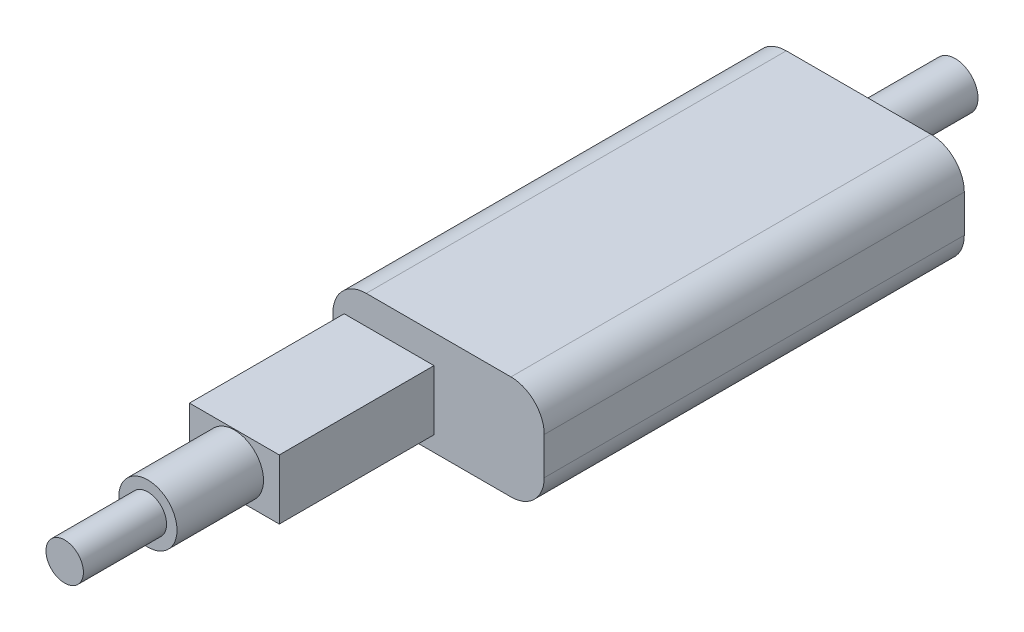
ISO-10303-21;
HEADER;
FILE_DESCRIPTION(('STEP AP214'),'2;1');
FILE_NAME('part.step','',(''),(''),'','','');
FILE_SCHEMA(('AUTOMOTIVE_DESIGN { 1 0 10303 214 1 1 1 1 }'));
ENDSEC;
DATA;
#1=APPLICATION_CONTEXT('core data for automotive mechanical design processes');
#2=APPLICATION_PROTOCOL_DEFINITION('international standard','automotive_design',2000,#1);
#3=PRODUCT_CONTEXT('',#1,'mechanical');
#4=PRODUCT('Part','Part','',(#3));
#5=PRODUCT_RELATED_PRODUCT_CATEGORY('part','',(#4));
#6=PRODUCT_DEFINITION_FORMATION('','',#4);
#7=PRODUCT_DEFINITION_CONTEXT('part definition',#1,'design');
#8=PRODUCT_DEFINITION('design','',#6,#7);
#9=PRODUCT_DEFINITION_SHAPE('','',#8);
#10=(LENGTH_UNIT() NAMED_UNIT(*) SI_UNIT(.MILLI.,.METRE.));
#11=(NAMED_UNIT(*) PLANE_ANGLE_UNIT() SI_UNIT($,.RADIAN.));
#12=(NAMED_UNIT(*) SI_UNIT($,.STERADIAN.) SOLID_ANGLE_UNIT());
#13=UNCERTAINTY_MEASURE_WITH_UNIT(LENGTH_MEASURE(1.E-05),#10,'distance_accuracy_value','');
#14=(GEOMETRIC_REPRESENTATION_CONTEXT(3) GLOBAL_UNCERTAINTY_ASSIGNED_CONTEXT((#13)) GLOBAL_UNIT_ASSIGNED_CONTEXT((#10,
#11,#12)) REPRESENTATION_CONTEXT('',''));
#15=CARTESIAN_POINT('',(0.,0.,0.));
#16=DIRECTION('',(0.,0.,1.));
#17=DIRECTION('',(1.,0.,0.));
#18=AXIS2_PLACEMENT_3D('',#15,#16,#17);
#19=CARTESIAN_POINT('',(0.,0.,-25.25));
#20=DIRECTION('',(0.,0.,1.));
#21=DIRECTION('',(1.,0.,0.));
#22=AXIS2_PLACEMENT_3D('',#19,#20,#21);
#23=PLANE('',#22);
#24=DIRECTION('',(1.,0.,0.));
#25=VECTOR('',#24,1.);
#26=CARTESIAN_POINT('',(-12.7,-6.25,-25.25));
#27=LINE('',#26,#25);
#28=CARTESIAN_POINT('',(-8.7,-6.25,-25.25));
#29=VERTEX_POINT('',#28);
#30=CARTESIAN_POINT('',(8.7,-6.25,-25.25));
#31=VERTEX_POINT('',#30);
#32=EDGE_CURVE('E315',#29,#31,#27,.T.);
#33=ORIENTED_EDGE('',*,*,#32,.F.);
#34=CARTESIAN_POINT('',(-8.7,-2.25,-25.25));
#35=DIRECTION('',(0.,0.,1.));
#36=DIRECTION('',(1.,0.,0.));
#37=AXIS2_PLACEMENT_3D('',#34,#35,#36);
#38=CIRCLE('',#37,4.);
#39=CARTESIAN_POINT('',(-12.7,-2.25,-25.25));
#40=VERTEX_POINT('',#39);
#41=EDGE_CURVE('E333',#29,#40,#38,.F.);
#42=ORIENTED_EDGE('',*,*,#41,.T.);
#43=DIRECTION('',(0.,-1.,0.));
#44=VECTOR('',#43,1.);
#45=CARTESIAN_POINT('',(-12.7,6.25,-25.25));
#46=LINE('',#45,#44);
#47=CARTESIAN_POINT('',(-12.7,2.25,-25.25));
#48=VERTEX_POINT('',#47);
#49=EDGE_CURVE('E298',#48,#40,#46,.T.);
#50=ORIENTED_EDGE('',*,*,#49,.F.);
#51=CARTESIAN_POINT('',(-8.7,2.25,-25.25));
#52=DIRECTION('',(0.,0.,1.));
#53=DIRECTION('',(1.,0.,0.));
#54=AXIS2_PLACEMENT_3D('',#51,#52,#53);
#55=CIRCLE('',#54,4.);
#56=CARTESIAN_POINT('',(-8.7,6.25,-25.25));
#57=VERTEX_POINT('',#56);
#58=EDGE_CURVE('E327',#48,#57,#55,.F.);
#59=ORIENTED_EDGE('',*,*,#58,.T.);
#60=DIRECTION('',(-1.,0.,0.));
#61=VECTOR('',#60,1.);
#62=CARTESIAN_POINT('',(-12.7,6.25,-25.25));
#63=LINE('',#62,#61);
#64=CARTESIAN_POINT('',(8.7,6.25,-25.25));
#65=VERTEX_POINT('',#64);
#66=EDGE_CURVE('E303',#65,#57,#63,.T.);
#67=ORIENTED_EDGE('',*,*,#66,.F.);
#68=CARTESIAN_POINT('',(8.7,2.25,-25.25));
#69=DIRECTION('',(0.,0.,1.));
#70=DIRECTION('',(1.,0.,0.));
#71=AXIS2_PLACEMENT_3D('',#68,#69,#70);
#72=CIRCLE('',#71,4.);
#73=CARTESIAN_POINT('',(12.7,2.25,-25.25));
#74=VERTEX_POINT('',#73);
#75=EDGE_CURVE('E329',#65,#74,#72,.F.);
#76=ORIENTED_EDGE('',*,*,#75,.T.);
#77=DIRECTION('',(0.,1.,0.));
#78=VECTOR('',#77,1.);
#79=CARTESIAN_POINT('',(12.7,6.25,-25.25));
#80=LINE('',#79,#78);
#81=CARTESIAN_POINT('',(12.7,-2.25,-25.25));
#82=VERTEX_POINT('',#81);
#83=EDGE_CURVE('E318',#82,#74,#80,.T.);
#84=ORIENTED_EDGE('',*,*,#83,.F.);
#85=CARTESIAN_POINT('',(8.7,-2.25,-25.25));
#86=DIRECTION('',(0.,0.,1.));
#87=DIRECTION('',(1.,0.,0.));
#88=AXIS2_PLACEMENT_3D('',#85,#86,#87);
#89=CIRCLE('',#88,4.);
#90=EDGE_CURVE('E331',#82,#31,#89,.F.);
#91=ORIENTED_EDGE('',*,*,#90,.T.);
#92=EDGE_LOOP('',(#33,#42,#50,#59,#67,#76,#84,#91));
#93=FACE_BOUND('',#92,.T.);
#94=DIRECTION('',(0.,-1.,0.));
#95=VECTOR('',#94,1.);
#96=CARTESIAN_POINT('',(7.5,3.75,-25.25));
#97=LINE('',#96,#95);
#98=CARTESIAN_POINT('',(7.5,3.75,-25.25));
#99=VERTEX_POINT('',#98);
#100=CARTESIAN_POINT('',(7.5,-1.85,-25.25));
#101=VERTEX_POINT('',#100);
#102=EDGE_CURVE('E57',#99,#101,#97,.T.);
#103=ORIENTED_EDGE('',*,*,#102,.F.);
#104=DIRECTION('',(1.,0.,0.));
#105=VECTOR('',#104,1.);
#106=CARTESIAN_POINT('',(7.5,3.75,-25.25));
#107=LINE('',#106,#105);
#108=CARTESIAN_POINT('',(-7.5,3.75,-25.25));
#109=VERTEX_POINT('',#108);
#110=EDGE_CURVE('E204',#109,#99,#107,.T.);
#111=ORIENTED_EDGE('',*,*,#110,.F.);
#112=DIRECTION('',(0.,1.,0.));
#113=VECTOR('',#112,1.);
#114=CARTESIAN_POINT('',(-7.5,3.75,-25.25));
#115=LINE('',#114,#113);
#116=CARTESIAN_POINT('',(-7.5,-1.85,-25.25));
#117=VERTEX_POINT('',#116);
#118=EDGE_CURVE('E211',#117,#109,#115,.T.);
#119=ORIENTED_EDGE('',*,*,#118,.F.);
#120=DIRECTION('',(-1.,0.,0.));
#121=VECTOR('',#120,1.);
#122=CARTESIAN_POINT('',(7.5,-1.85,-25.25));
#123=LINE('',#122,#121);
#124=EDGE_CURVE('E208',#101,#117,#123,.T.);
#125=ORIENTED_EDGE('',*,*,#124,.F.);
#126=EDGE_LOOP('',(#103,#111,#119,#125));
#127=FACE_BOUND('',#126,.T.);
#128=ADVANCED_FACE('F33',(#93,#127),#23,.F.);
#129=CARTESIAN_POINT('',(0.,0.,25.25));
#130=DIRECTION('',(0.,0.,1.));
#131=DIRECTION('',(1.,0.,0.));
#132=AXIS2_PLACEMENT_3D('',#129,#130,#131);
#133=PLANE('',#132);
#134=DIRECTION('',(0.,-1.,0.));
#135=VECTOR('',#134,1.);
#136=CARTESIAN_POINT('',(-12.7,6.25,25.25));
#137=LINE('',#136,#135);
#138=CARTESIAN_POINT('',(-12.7,2.25,25.25));
#139=VERTEX_POINT('',#138);
#140=CARTESIAN_POINT('',(-12.7,-2.25,25.25));
#141=VERTEX_POINT('',#140);
#142=EDGE_CURVE('E299',#139,#141,#137,.T.);
#143=ORIENTED_EDGE('',*,*,#142,.T.);
#144=CARTESIAN_POINT('',(-8.7,-2.25,25.25));
#145=DIRECTION('',(0.,0.,1.));
#146=DIRECTION('',(1.,0.,0.));
#147=AXIS2_PLACEMENT_3D('',#144,#145,#146);
#148=CIRCLE('',#147,4.);
#149=CARTESIAN_POINT('',(-8.7,-6.25,25.25));
#150=VERTEX_POINT('',#149);
#151=EDGE_CURVE('E346',#141,#150,#148,.T.);
#152=ORIENTED_EDGE('',*,*,#151,.T.);
#153=DIRECTION('',(1.,0.,0.));
#154=VECTOR('',#153,1.);
#155=CARTESIAN_POINT('',(-12.7,-6.25,25.25));
#156=LINE('',#155,#154);
#157=CARTESIAN_POINT('',(8.7,-6.25,25.25));
#158=VERTEX_POINT('',#157);
#159=EDGE_CURVE('E302',#150,#158,#156,.T.);
#160=ORIENTED_EDGE('',*,*,#159,.T.);
#161=CARTESIAN_POINT('',(8.7,-2.25,25.25));
#162=DIRECTION('',(0.,0.,1.));
#163=DIRECTION('',(1.,0.,0.));
#164=AXIS2_PLACEMENT_3D('',#161,#162,#163);
#165=CIRCLE('',#164,4.);
#166=CARTESIAN_POINT('',(12.7,-2.25,25.25));
#167=VERTEX_POINT('',#166);
#168=EDGE_CURVE('E344',#158,#167,#165,.T.);
#169=ORIENTED_EDGE('',*,*,#168,.T.);
#170=DIRECTION('',(0.,1.,0.));
#171=VECTOR('',#170,1.);
#172=CARTESIAN_POINT('',(12.7,6.25,25.25));
#173=LINE('',#172,#171);
#174=CARTESIAN_POINT('',(12.7,2.25,25.25));
#175=VERTEX_POINT('',#174);
#176=EDGE_CURVE('E306',#167,#175,#173,.T.);
#177=ORIENTED_EDGE('',*,*,#176,.T.);
#178=CARTESIAN_POINT('',(8.7,2.25,25.25));
#179=DIRECTION('',(0.,0.,1.));
#180=DIRECTION('',(1.,0.,0.));
#181=AXIS2_PLACEMENT_3D('',#178,#179,#180);
#182=CIRCLE('',#181,4.);
#183=CARTESIAN_POINT('',(8.7,6.25,25.25));
#184=VERTEX_POINT('',#183);
#185=EDGE_CURVE('E342',#175,#184,#182,.T.);
#186=ORIENTED_EDGE('',*,*,#185,.T.);
#187=DIRECTION('',(-1.,0.,0.));
#188=VECTOR('',#187,1.);
#189=CARTESIAN_POINT('',(-12.7,6.25,25.25));
#190=LINE('',#189,#188);
#191=CARTESIAN_POINT('',(-8.7,6.25,25.25));
#192=VERTEX_POINT('',#191);
#193=EDGE_CURVE('E309',#184,#192,#190,.T.);
#194=ORIENTED_EDGE('',*,*,#193,.T.);
#195=CARTESIAN_POINT('',(-8.7,2.25,25.25));
#196=DIRECTION('',(0.,0.,1.));
#197=DIRECTION('',(1.,0.,0.));
#198=AXIS2_PLACEMENT_3D('',#195,#196,#197);
#199=CIRCLE('',#198,4.);
#200=EDGE_CURVE('E340',#192,#139,#199,.T.);
#201=ORIENTED_EDGE('',*,*,#200,.T.);
#202=EDGE_LOOP('',(#143,#152,#160,#169,#177,#186,#194,#201));
#203=FACE_BOUND('',#202,.T.);
#204=DIRECTION('',(1.,0.,0.));
#205=VECTOR('',#204,1.);
#206=CARTESIAN_POINT('',(-7.9,-0.250000000000002,25.25));
#207=LINE('',#206,#205);
#208=CARTESIAN_POINT('',(-7.9,-0.250000000000002,25.25));
#209=VERTEX_POINT('',#208);
#210=CARTESIAN_POINT('',(-1.,-0.250000000000002,25.25));
#211=VERTEX_POINT('',#210);
#212=EDGE_CURVE('E283',#209,#211,#207,.T.);
#213=ORIENTED_EDGE('',*,*,#212,.F.);
#214=DIRECTION('',(0.,-1.,0.));
#215=VECTOR('',#214,1.);
#216=CARTESIAN_POINT('',(-7.9,1.65,25.25));
#217=LINE('',#216,#215);
#218=CARTESIAN_POINT('',(-7.9,1.65,25.25));
#219=VERTEX_POINT('',#218);
#220=EDGE_CURVE('E266',#219,#209,#217,.T.);
#221=ORIENTED_EDGE('',*,*,#220,.F.);
#222=DIRECTION('',(-1.,0.,0.));
#223=VECTOR('',#222,1.);
#224=CARTESIAN_POINT('',(-7.9,1.65,25.25));
#225=LINE('',#224,#223);
#226=CARTESIAN_POINT('',(-1.,1.65,25.25));
#227=VERTEX_POINT('',#226);
#228=EDGE_CURVE('E271',#227,#219,#225,.T.);
#229=ORIENTED_EDGE('',*,*,#228,.F.);
#230=DIRECTION('',(0.,1.,0.));
#231=VECTOR('',#230,1.);
#232=CARTESIAN_POINT('',(-1.,1.65,25.25));
#233=LINE('',#232,#231);
#234=EDGE_CURVE('E285',#211,#227,#233,.T.);
#235=ORIENTED_EDGE('',*,*,#234,.F.);
#236=EDGE_LOOP('',(#213,#221,#229,#235));
#237=FACE_BOUND('',#236,.T.);
#238=ADVANCED_FACE('F375',(#203,#237),#133,.T.);
#239=CARTESIAN_POINT('',(-12.7,6.25,25.25));
#240=DIRECTION('',(1.,0.,0.));
#241=DIRECTION('',(0.,0.,-1.));
#242=AXIS2_PLACEMENT_3D('',#239,#240,#241);
#243=PLANE('',#242);
#244=ORIENTED_EDGE('',*,*,#49,.T.);
#245=DIRECTION('',(0.,0.,-1.));
#246=VECTOR('',#245,1.);
#247=CARTESIAN_POINT('',(-12.7,-2.25,25.25));
#248=LINE('',#247,#246);
#249=EDGE_CURVE('E338',#40,#141,#248,.F.);
#250=ORIENTED_EDGE('',*,*,#249,.T.);
#251=ORIENTED_EDGE('',*,*,#142,.F.);
#252=DIRECTION('',(0.,0.,-1.));
#253=VECTOR('',#252,1.);
#254=CARTESIAN_POINT('',(-12.7,2.25,25.25));
#255=LINE('',#254,#253);
#256=EDGE_CURVE('E335',#139,#48,#255,.T.);
#257=ORIENTED_EDGE('',*,*,#256,.T.);
#258=EDGE_LOOP('',(#244,#250,#251,#257));
#259=FACE_BOUND('',#258,.T.);
#260=ADVANCED_FACE('F371',(#259),#243,.F.);
#261=CARTESIAN_POINT('',(-12.7,-6.25,25.25));
#262=DIRECTION('',(0.,1.,0.));
#263=DIRECTION('',(-1.,0.,0.));
#264=AXIS2_PLACEMENT_3D('',#261,#262,#263);
#265=PLANE('',#264);
#266=ORIENTED_EDGE('',*,*,#159,.F.);
#267=DIRECTION('',(0.,0.,-1.));
#268=VECTOR('',#267,1.);
#269=CARTESIAN_POINT('',(-8.7,-6.25,25.25));
#270=LINE('',#269,#268);
#271=EDGE_CURVE('E324',#150,#29,#270,.T.);
#272=ORIENTED_EDGE('',*,*,#271,.T.);
#273=ORIENTED_EDGE('',*,*,#32,.T.);
#274=DIRECTION('',(0.,0.,-1.));
#275=VECTOR('',#274,1.);
#276=CARTESIAN_POINT('',(8.7,-6.25,25.25));
#277=LINE('',#276,#275);
#278=EDGE_CURVE('E312',#31,#158,#277,.F.);
#279=ORIENTED_EDGE('',*,*,#278,.T.);
#280=EDGE_LOOP('',(#266,#272,#273,#279));
#281=FACE_BOUND('',#280,.T.);
#282=ADVANCED_FACE('F382',(#281),#265,.F.);
#283=CARTESIAN_POINT('',(12.7,6.25,25.25));
#284=DIRECTION('',(-1.,0.,0.));
#285=DIRECTION('',(0.,0.,1.));
#286=AXIS2_PLACEMENT_3D('',#283,#284,#285);
#287=PLANE('',#286);
#288=ORIENTED_EDGE('',*,*,#176,.F.);
#289=DIRECTION('',(0.,0.,-1.));
#290=VECTOR('',#289,1.);
#291=CARTESIAN_POINT('',(12.7,-2.25,25.25));
#292=LINE('',#291,#290);
#293=EDGE_CURVE('E350',#167,#82,#292,.T.);
#294=ORIENTED_EDGE('',*,*,#293,.T.);
#295=ORIENTED_EDGE('',*,*,#83,.T.);
#296=DIRECTION('',(0.,0.,-1.));
#297=VECTOR('',#296,1.);
#298=CARTESIAN_POINT('',(12.7,2.25,25.25));
#299=LINE('',#298,#297);
#300=EDGE_CURVE('E348',#74,#175,#299,.F.);
#301=ORIENTED_EDGE('',*,*,#300,.T.);
#302=EDGE_LOOP('',(#288,#294,#295,#301));
#303=FACE_BOUND('',#302,.T.);
#304=ADVANCED_FACE('F390',(#303),#287,.F.);
#305=CARTESIAN_POINT('',(-12.7,6.25,25.25));
#306=DIRECTION('',(0.,-1.,0.));
#307=DIRECTION('',(0.,0.,-1.));
#308=AXIS2_PLACEMENT_3D('',#305,#306,#307);
#309=PLANE('',#308);
#310=ORIENTED_EDGE('',*,*,#193,.F.);
#311=DIRECTION('',(0.,0.,-1.));
#312=VECTOR('',#311,1.);
#313=CARTESIAN_POINT('',(8.7,6.25,25.25));
#314=LINE('',#313,#312);
#315=EDGE_CURVE('E37',#184,#65,#314,.T.);
#316=ORIENTED_EDGE('',*,*,#315,.T.);
#317=ORIENTED_EDGE('',*,*,#66,.T.);
#318=DIRECTION('',(0.,0.,-1.));
#319=VECTOR('',#318,1.);
#320=CARTESIAN_POINT('',(-8.7,6.25,25.25));
#321=LINE('',#320,#319);
#322=EDGE_CURVE('E352',#57,#192,#321,.F.);
#323=ORIENTED_EDGE('',*,*,#322,.T.);
#324=EDGE_LOOP('',(#310,#316,#317,#323));
#325=FACE_BOUND('',#324,.T.);
#326=ADVANCED_FACE('F359',(#325),#309,.F.);
#327=CARTESIAN_POINT('',(-8.7,-2.25,25.25));
#328=DIRECTION('',(0.,0.,-1.));
#329=DIRECTION('',(-1.,0.,0.));
#330=AXIS2_PLACEMENT_3D('',#327,#328,#329);
#331=CYLINDRICAL_SURFACE('',#330,4.);
#332=ORIENTED_EDGE('',*,*,#151,.F.);
#333=ORIENTED_EDGE('',*,*,#249,.F.);
#334=ORIENTED_EDGE('',*,*,#41,.F.);
#335=ORIENTED_EDGE('',*,*,#271,.F.);
#336=EDGE_LOOP('',(#332,#333,#334,#335));
#337=FACE_BOUND('',#336,.T.);
#338=ADVANCED_FACE('F380',(#337),#331,.T.);
#339=CARTESIAN_POINT('',(8.7,-2.25,25.25));
#340=DIRECTION('',(0.,0.,-1.));
#341=DIRECTION('',(-1.,0.,0.));
#342=AXIS2_PLACEMENT_3D('',#339,#340,#341);
#343=CYLINDRICAL_SURFACE('',#342,4.);
#344=ORIENTED_EDGE('',*,*,#168,.F.);
#345=ORIENTED_EDGE('',*,*,#278,.F.);
#346=ORIENTED_EDGE('',*,*,#90,.F.);
#347=ORIENTED_EDGE('',*,*,#293,.F.);
#348=EDGE_LOOP('',(#344,#345,#346,#347));
#349=FACE_BOUND('',#348,.T.);
#350=ADVANCED_FACE('F387',(#349),#343,.T.);
#351=CARTESIAN_POINT('',(8.7,2.25,25.25));
#352=DIRECTION('',(0.,0.,-1.));
#353=DIRECTION('',(-1.,0.,0.));
#354=AXIS2_PLACEMENT_3D('',#351,#352,#353);
#355=CYLINDRICAL_SURFACE('',#354,4.);
#356=ORIENTED_EDGE('',*,*,#185,.F.);
#357=ORIENTED_EDGE('',*,*,#300,.F.);
#358=ORIENTED_EDGE('',*,*,#75,.F.);
#359=ORIENTED_EDGE('',*,*,#315,.F.);
#360=EDGE_LOOP('',(#356,#357,#358,#359));
#361=FACE_BOUND('',#360,.T.);
#362=ADVANCED_FACE('F392',(#361),#355,.T.);
#363=CARTESIAN_POINT('',(-8.7,2.25,25.25));
#364=DIRECTION('',(0.,0.,-1.));
#365=DIRECTION('',(-1.,0.,0.));
#366=AXIS2_PLACEMENT_3D('',#363,#364,#365);
#367=CYLINDRICAL_SURFACE('',#366,4.);
#368=ORIENTED_EDGE('',*,*,#200,.F.);
#369=ORIENTED_EDGE('',*,*,#322,.F.);
#370=ORIENTED_EDGE('',*,*,#58,.F.);
#371=ORIENTED_EDGE('',*,*,#256,.F.);
#372=EDGE_LOOP('',(#368,#369,#370,#371));
#373=FACE_BOUND('',#372,.T.);
#374=ADVANCED_FACE('F35',(#373),#367,.T.);
#375=CARTESIAN_POINT('',(-7.9,1.65,26.75));
#376=DIRECTION('',(1.,0.,0.));
#377=DIRECTION('',(0.,0.,-1.));
#378=AXIS2_PLACEMENT_3D('',#375,#376,#377);
#379=PLANE('',#378);
#380=ORIENTED_EDGE('',*,*,#220,.T.);
#381=DIRECTION('',(0.,0.,-1.));
#382=VECTOR('',#381,1.);
#383=CARTESIAN_POINT('',(-7.9,-0.250000000000002,26.75));
#384=LINE('',#383,#382);
#385=CARTESIAN_POINT('',(-7.9,-0.250000000000002,26.75));
#386=VERTEX_POINT('',#385);
#387=EDGE_CURVE('E296',#386,#209,#384,.T.);
#388=ORIENTED_EDGE('',*,*,#387,.F.);
#389=DIRECTION('',(0.,-1.,0.));
#390=VECTOR('',#389,1.);
#391=CARTESIAN_POINT('',(-7.9,1.65,26.75));
#392=LINE('',#391,#390);
#393=CARTESIAN_POINT('',(-7.9,1.65,26.75));
#394=VERTEX_POINT('',#393);
#395=EDGE_CURVE('E267',#394,#386,#392,.T.);
#396=ORIENTED_EDGE('',*,*,#395,.F.);
#397=DIRECTION('',(0.,0.,-1.));
#398=VECTOR('',#397,1.);
#399=CARTESIAN_POINT('',(-7.9,1.65,26.75));
#400=LINE('',#399,#398);
#401=EDGE_CURVE('E280',#394,#219,#400,.T.);
#402=ORIENTED_EDGE('',*,*,#401,.T.);
#403=EDGE_LOOP('',(#380,#388,#396,#402));
#404=FACE_BOUND('',#403,.T.);
#405=ADVANCED_FACE('F398',(#404),#379,.F.);
#406=CARTESIAN_POINT('',(-7.9,-0.250000000000002,26.75));
#407=DIRECTION('',(0.,1.,0.));
#408=DIRECTION('',(0.,0.,1.));
#409=AXIS2_PLACEMENT_3D('',#406,#407,#408);
#410=PLANE('',#409);
#411=ORIENTED_EDGE('',*,*,#212,.T.);
#412=DIRECTION('',(0.,0.,-1.));
#413=VECTOR('',#412,1.);
#414=CARTESIAN_POINT('',(-1.,-0.250000000000002,26.75));
#415=LINE('',#414,#413);
#416=CARTESIAN_POINT('',(-1.,-0.250000000000002,26.75));
#417=VERTEX_POINT('',#416);
#418=EDGE_CURVE('E293',#417,#211,#415,.T.);
#419=ORIENTED_EDGE('',*,*,#418,.F.);
#420=DIRECTION('',(1.,0.,0.));
#421=VECTOR('',#420,1.);
#422=CARTESIAN_POINT('',(-7.9,-0.250000000000002,26.75));
#423=LINE('',#422,#421);
#424=EDGE_CURVE('E270',#386,#417,#423,.T.);
#425=ORIENTED_EDGE('',*,*,#424,.F.);
#426=ORIENTED_EDGE('',*,*,#387,.T.);
#427=EDGE_LOOP('',(#411,#419,#425,#426));
#428=FACE_BOUND('',#427,.T.);
#429=ADVANCED_FACE('F452',(#428),#410,.F.);
#430=CARTESIAN_POINT('',(-1.,1.65,26.75));
#431=DIRECTION('',(-1.,0.,0.));
#432=DIRECTION('',(0.,-1.,0.));
#433=AXIS2_PLACEMENT_3D('',#430,#431,#432);
#434=PLANE('',#433);
#435=ORIENTED_EDGE('',*,*,#234,.T.);
#436=DIRECTION('',(0.,0.,-1.));
#437=VECTOR('',#436,1.);
#438=CARTESIAN_POINT('',(-1.,1.65,26.75));
#439=LINE('',#438,#437);
#440=CARTESIAN_POINT('',(-1.,1.65,26.75));
#441=VERTEX_POINT('',#440);
#442=EDGE_CURVE('E291',#441,#227,#439,.T.);
#443=ORIENTED_EDGE('',*,*,#442,.F.);
#444=DIRECTION('',(0.,1.,0.));
#445=VECTOR('',#444,1.);
#446=CARTESIAN_POINT('',(-1.,1.65,26.75));
#447=LINE('',#446,#445);
#448=EDGE_CURVE('E274',#417,#441,#447,.T.);
#449=ORIENTED_EDGE('',*,*,#448,.F.);
#450=ORIENTED_EDGE('',*,*,#418,.T.);
#451=EDGE_LOOP('',(#435,#443,#449,#450));
#452=FACE_BOUND('',#451,.T.);
#453=ADVANCED_FACE('F461',(#452),#434,.F.);
#454=CARTESIAN_POINT('',(-7.9,1.65,26.75));
#455=DIRECTION('',(0.,-1.,0.));
#456=DIRECTION('',(1.,0.,0.));
#457=AXIS2_PLACEMENT_3D('',#454,#455,#456);
#458=PLANE('',#457);
#459=ORIENTED_EDGE('',*,*,#228,.T.);
#460=ORIENTED_EDGE('',*,*,#401,.F.);
#461=DIRECTION('',(-1.,0.,0.));
#462=VECTOR('',#461,1.);
#463=CARTESIAN_POINT('',(-7.9,1.65,26.75));
#464=LINE('',#463,#462);
#465=EDGE_CURVE('E277',#441,#394,#464,.T.);
#466=ORIENTED_EDGE('',*,*,#465,.F.);
#467=ORIENTED_EDGE('',*,*,#442,.T.);
#468=EDGE_LOOP('',(#459,#460,#466,#467));
#469=FACE_BOUND('',#468,.T.);
#470=ADVANCED_FACE('F471',(#469),#458,.F.);
#471=CARTESIAN_POINT('',(0.,0.,26.75));
#472=DIRECTION('',(0.,0.,1.));
#473=DIRECTION('',(1.,0.,0.));
#474=AXIS2_PLACEMENT_3D('',#471,#472,#473);
#475=PLANE('',#474);
#476=DIRECTION('',(0.,-1.,0.));
#477=VECTOR('',#476,1.);
#478=CARTESIAN_POINT('',(-9.85,4.3,26.75));
#479=LINE('',#478,#477);
#480=CARTESIAN_POINT('',(-9.85,4.3,26.75));
#481=VERTEX_POINT('',#480);
#482=CARTESIAN_POINT('',(-9.85,-2.9,26.75));
#483=VERTEX_POINT('',#482);
#484=EDGE_CURVE('E234',#481,#483,#479,.T.);
#485=ORIENTED_EDGE('',*,*,#484,.F.);
#486=DIRECTION('',(-1.,0.,0.));
#487=VECTOR('',#486,1.);
#488=CARTESIAN_POINT('',(-9.85,4.3,26.75));
#489=LINE('',#488,#487);
#490=CARTESIAN_POINT('',(0.949999999999999,4.3,26.75));
#491=VERTEX_POINT('',#490);
#492=EDGE_CURVE('E241',#491,#481,#489,.T.);
#493=ORIENTED_EDGE('',*,*,#492,.F.);
#494=DIRECTION('',(0.,1.,0.));
#495=VECTOR('',#494,1.);
#496=CARTESIAN_POINT('',(0.949999999999999,4.3,26.75));
#497=LINE('',#496,#495);
#498=CARTESIAN_POINT('',(0.949999999999999,-2.9,26.75));
#499=VERTEX_POINT('',#498);
#500=EDGE_CURVE('E252',#499,#491,#497,.T.);
#501=ORIENTED_EDGE('',*,*,#500,.F.);
#502=DIRECTION('',(1.,0.,0.));
#503=VECTOR('',#502,1.);
#504=CARTESIAN_POINT('',(-9.85,-2.9,26.75));
#505=LINE('',#504,#503);
#506=EDGE_CURVE('E250',#483,#499,#505,.T.);
#507=ORIENTED_EDGE('',*,*,#506,.F.);
#508=EDGE_LOOP('',(#485,#493,#501,#507));
#509=FACE_BOUND('',#508,.T.);
#510=ORIENTED_EDGE('',*,*,#465,.T.);
#511=ORIENTED_EDGE('',*,*,#395,.T.);
#512=ORIENTED_EDGE('',*,*,#424,.T.);
#513=ORIENTED_EDGE('',*,*,#448,.T.);
#514=EDGE_LOOP('',(#510,#511,#512,#513));
#515=FACE_BOUND('',#514,.T.);
#516=ADVANCED_FACE('F481',(#509,#515),#475,.F.);
#517=CARTESIAN_POINT('',(-9.85,4.3,45.35));
#518=DIRECTION('',(1.,0.,0.));
#519=DIRECTION('',(0.,0.,-1.));
#520=AXIS2_PLACEMENT_3D('',#517,#518,#519);
#521=PLANE('',#520);
#522=ORIENTED_EDGE('',*,*,#484,.T.);
#523=DIRECTION('',(0.,0.,-1.));
#524=VECTOR('',#523,1.);
#525=CARTESIAN_POINT('',(-9.85,-2.9,45.35));
#526=LINE('',#525,#524);
#527=CARTESIAN_POINT('',(-9.85,-2.9,45.35));
#528=VERTEX_POINT('',#527);
#529=EDGE_CURVE('E263',#528,#483,#526,.T.);
#530=ORIENTED_EDGE('',*,*,#529,.F.);
#531=DIRECTION('',(0.,-1.,0.));
#532=VECTOR('',#531,1.);
#533=CARTESIAN_POINT('',(-9.85,4.3,45.35));
#534=LINE('',#533,#532);
#535=CARTESIAN_POINT('',(-9.85,4.3,45.35));
#536=VERTEX_POINT('',#535);
#537=EDGE_CURVE('E237',#536,#528,#534,.T.);
#538=ORIENTED_EDGE('',*,*,#537,.F.);
#539=DIRECTION('',(0.,0.,-1.));
#540=VECTOR('',#539,1.);
#541=CARTESIAN_POINT('',(-9.85,4.3,45.35));
#542=LINE('',#541,#540);
#543=EDGE_CURVE('E247',#536,#481,#542,.T.);
#544=ORIENTED_EDGE('',*,*,#543,.T.);
#545=EDGE_LOOP('',(#522,#530,#538,#544));
#546=FACE_BOUND('',#545,.T.);
#547=ADVANCED_FACE('F491',(#546),#521,.F.);
#548=CARTESIAN_POINT('',(-9.85,-2.9,45.35));
#549=DIRECTION('',(0.,1.,0.));
#550=DIRECTION('',(-1.,0.,0.));
#551=AXIS2_PLACEMENT_3D('',#548,#549,#550);
#552=PLANE('',#551);
#553=ORIENTED_EDGE('',*,*,#506,.T.);
#554=DIRECTION('',(0.,0.,-1.));
#555=VECTOR('',#554,1.);
#556=CARTESIAN_POINT('',(0.949999999999999,-2.9,45.35));
#557=LINE('',#556,#555);
#558=CARTESIAN_POINT('',(0.949999999999999,-2.9,45.35));
#559=VERTEX_POINT('',#558);
#560=EDGE_CURVE('E260',#559,#499,#557,.T.);
#561=ORIENTED_EDGE('',*,*,#560,.F.);
#562=DIRECTION('',(1.,0.,0.));
#563=VECTOR('',#562,1.);
#564=CARTESIAN_POINT('',(-9.85,-2.9,45.35));
#565=LINE('',#564,#563);
#566=EDGE_CURVE('E240',#528,#559,#565,.T.);
#567=ORIENTED_EDGE('',*,*,#566,.F.);
#568=ORIENTED_EDGE('',*,*,#529,.T.);
#569=EDGE_LOOP('',(#553,#561,#567,#568));
#570=FACE_BOUND('',#569,.T.);
#571=ADVANCED_FACE('F501',(#570),#552,.F.);
#572=CARTESIAN_POINT('',(0.949999999999999,4.3,45.35));
#573=DIRECTION('',(-1.,0.,0.));
#574=DIRECTION('',(0.,0.,1.));
#575=AXIS2_PLACEMENT_3D('',#572,#573,#574);
#576=PLANE('',#575);
#577=ORIENTED_EDGE('',*,*,#500,.T.);
#578=DIRECTION('',(0.,0.,-1.));
#579=VECTOR('',#578,1.);
#580=CARTESIAN_POINT('',(0.949999999999999,4.3,45.35));
#581=LINE('',#580,#579);
#582=CARTESIAN_POINT('',(0.949999999999999,4.3,45.35));
#583=VERTEX_POINT('',#582);
#584=EDGE_CURVE('E257',#583,#491,#581,.T.);
#585=ORIENTED_EDGE('',*,*,#584,.F.);
#586=DIRECTION('',(0.,1.,0.));
#587=VECTOR('',#586,1.);
#588=CARTESIAN_POINT('',(0.949999999999999,4.3,45.35));
#589=LINE('',#588,#587);
#590=EDGE_CURVE('E243',#559,#583,#589,.T.);
#591=ORIENTED_EDGE('',*,*,#590,.F.);
#592=ORIENTED_EDGE('',*,*,#560,.T.);
#593=EDGE_LOOP('',(#577,#585,#591,#592));
#594=FACE_BOUND('',#593,.T.);
#595=ADVANCED_FACE('F511',(#594),#576,.F.);
#596=CARTESIAN_POINT('',(-9.85,4.3,45.35));
#597=DIRECTION('',(0.,-1.,0.));
#598=DIRECTION('',(1.,0.,0.));
#599=AXIS2_PLACEMENT_3D('',#596,#597,#598);
#600=PLANE('',#599);
#601=ORIENTED_EDGE('',*,*,#492,.T.);
#602=ORIENTED_EDGE('',*,*,#543,.F.);
#603=DIRECTION('',(-1.,0.,0.));
#604=VECTOR('',#603,1.);
#605=CARTESIAN_POINT('',(-9.85,4.3,45.35));
#606=LINE('',#605,#604);
#607=EDGE_CURVE('E245',#583,#536,#606,.T.);
#608=ORIENTED_EDGE('',*,*,#607,.F.);
#609=ORIENTED_EDGE('',*,*,#584,.T.);
#610=EDGE_LOOP('',(#601,#602,#608,#609));
#611=FACE_BOUND('',#610,.T.);
#612=ADVANCED_FACE('F521',(#611),#600,.F.);
#613=CARTESIAN_POINT('',(0.,0.,45.35));
#614=DIRECTION('',(0.,0.,1.));
#615=DIRECTION('',(1.,0.,0.));
#616=AXIS2_PLACEMENT_3D('',#613,#614,#615);
#617=PLANE('',#616);
#618=CARTESIAN_POINT('',(-4.45,0.699999999999998,45.35));
#619=DIRECTION('',(0.,0.,1.));
#620=DIRECTION('',(1.,0.,0.));
#621=AXIS2_PLACEMENT_3D('',#618,#619,#620);
#622=CIRCLE('',#621,3.5);
#623=CARTESIAN_POINT('',(-0.950000000000001,0.699999999999998,45.35));
#624=VERTEX_POINT('',#623);
#625=EDGE_CURVE('E231',#624,#624,#622,.T.);
#626=ORIENTED_EDGE('',*,*,#625,.F.);
#627=EDGE_LOOP('',(#626));
#628=FACE_BOUND('',#627,.T.);
#629=ORIENTED_EDGE('',*,*,#537,.T.);
#630=ORIENTED_EDGE('',*,*,#566,.T.);
#631=ORIENTED_EDGE('',*,*,#590,.T.);
#632=ORIENTED_EDGE('',*,*,#607,.T.);
#633=EDGE_LOOP('',(#629,#630,#631,#632));
#634=FACE_BOUND('',#633,.T.);
#635=ADVANCED_FACE('F531',(#628,#634),#617,.T.);
#636=CARTESIAN_POINT('',(-4.45,0.699999999999998,55.75));
#637=DIRECTION('',(0.,0.,-1.));
#638=DIRECTION('',(-1.,0.,0.));
#639=AXIS2_PLACEMENT_3D('',#636,#637,#638);
#640=CYLINDRICAL_SURFACE('',#639,3.5);
#641=CARTESIAN_POINT('',(-4.45,0.699999999999998,55.75));
#642=DIRECTION('',(0.,0.,1.));
#643=DIRECTION('',(1.,0.,0.));
#644=AXIS2_PLACEMENT_3D('',#641,#642,#643);
#645=CIRCLE('',#644,3.5);
#646=CARTESIAN_POINT('',(-0.950000000000001,0.699999999999998,55.75));
#647=VERTEX_POINT('',#646);
#648=EDGE_CURVE('E228',#647,#647,#645,.T.);
#649=ORIENTED_EDGE('',*,*,#648,.F.);
#650=EDGE_LOOP('',(#649));
#651=FACE_BOUND('',#650,.T.);
#652=ORIENTED_EDGE('',*,*,#625,.T.);
#653=EDGE_LOOP('',(#652));
#654=FACE_BOUND('',#653,.T.);
#655=ADVANCED_FACE('F541',(#651,#654),#640,.T.);
#656=CARTESIAN_POINT('',(-4.45,0.699999999999998,55.75));
#657=DIRECTION('',(0.,0.,1.));
#658=DIRECTION('',(1.,0.,0.));
#659=AXIS2_PLACEMENT_3D('',#656,#657,#658);
#660=PLANE('',#659);
#661=CARTESIAN_POINT('',(-4.45,0.699999999999998,55.75));
#662=DIRECTION('',(0.,0.,1.));
#663=DIRECTION('',(1.,0.,0.));
#664=AXIS2_PLACEMENT_3D('',#661,#662,#663);
#665=CIRCLE('',#664,2.25);
#666=CARTESIAN_POINT('',(-2.2,0.699999999999998,55.75));
#667=VERTEX_POINT('',#666);
#668=EDGE_CURVE('E42',#667,#667,#665,.T.);
#669=ORIENTED_EDGE('',*,*,#668,.F.);
#670=EDGE_LOOP('',(#669));
#671=FACE_BOUND('',#670,.T.);
#672=ORIENTED_EDGE('',*,*,#648,.T.);
#673=EDGE_LOOP('',(#672));
#674=FACE_BOUND('',#673,.T.);
#675=ADVANCED_FACE('F551',(#671,#674),#660,.T.);
#676=CARTESIAN_POINT('',(-4.45,0.699999999999998,65.75));
#677=DIRECTION('',(0.,0.,-1.));
#678=DIRECTION('',(-1.,0.,0.));
#679=AXIS2_PLACEMENT_3D('',#676,#677,#678);
#680=CYLINDRICAL_SURFACE('',#679,2.25);
#681=CARTESIAN_POINT('',(-4.45,0.699999999999998,65.75));
#682=DIRECTION('',(0.,0.,1.));
#683=DIRECTION('',(1.,0.,0.));
#684=AXIS2_PLACEMENT_3D('',#681,#682,#683);
#685=CIRCLE('',#684,2.25);
#686=CARTESIAN_POINT('',(-2.2,0.699999999999998,65.75));
#687=VERTEX_POINT('',#686);
#688=EDGE_CURVE('E225',#687,#687,#685,.T.);
#689=ORIENTED_EDGE('',*,*,#688,.F.);
#690=EDGE_LOOP('',(#689));
#691=FACE_BOUND('',#690,.T.);
#692=ORIENTED_EDGE('',*,*,#668,.T.);
#693=EDGE_LOOP('',(#692));
#694=FACE_BOUND('',#693,.T.);
#695=ADVANCED_FACE('F561',(#691,#694),#680,.T.);
#696=CARTESIAN_POINT('',(-4.45,0.699999999999998,65.75));
#697=DIRECTION('',(0.,0.,1.));
#698=DIRECTION('',(1.,0.,0.));
#699=AXIS2_PLACEMENT_3D('',#696,#697,#698);
#700=PLANE('',#699);
#701=ORIENTED_EDGE('',*,*,#688,.T.);
#702=EDGE_LOOP('',(#701));
#703=FACE_BOUND('',#702,.T.);
#704=ADVANCED_FACE('F570',(#703),#700,.T.);
#705=CARTESIAN_POINT('',(7.5,3.75,-26.85));
#706=DIRECTION('',(-1.,0.,0.));
#707=DIRECTION('',(0.,-1.,0.));
#708=AXIS2_PLACEMENT_3D('',#705,#706,#707);
#709=PLANE('',#708);
#710=ORIENTED_EDGE('',*,*,#102,.T.);
#711=DIRECTION('',(0.,0.,1.));
#712=VECTOR('',#711,1.);
#713=CARTESIAN_POINT('',(7.5,-1.85,-26.85));
#714=LINE('',#713,#712);
#715=CARTESIAN_POINT('',(7.5,-1.85,-26.85));
#716=VERTEX_POINT('',#715);
#717=EDGE_CURVE('E222',#716,#101,#714,.T.);
#718=ORIENTED_EDGE('',*,*,#717,.F.);
#719=DIRECTION('',(0.,-1.,0.));
#720=VECTOR('',#719,1.);
#721=CARTESIAN_POINT('',(7.5,3.75,-26.85));
#722=LINE('',#721,#720);
#723=CARTESIAN_POINT('',(7.5,3.75,-26.85));
#724=VERTEX_POINT('',#723);
#725=EDGE_CURVE('E200',#724,#716,#722,.T.);
#726=ORIENTED_EDGE('',*,*,#725,.F.);
#727=DIRECTION('',(0.,0.,1.));
#728=VECTOR('',#727,1.);
#729=CARTESIAN_POINT('',(7.5,3.75,-26.85));
#730=LINE('',#729,#728);
#731=EDGE_CURVE('E183',#724,#99,#730,.T.);
#732=ORIENTED_EDGE('',*,*,#731,.T.);
#733=EDGE_LOOP('',(#710,#718,#726,#732));
#734=FACE_BOUND('',#733,.T.);
#735=ADVANCED_FACE('F579',(#734),#709,.F.);
#736=CARTESIAN_POINT('',(7.5,-1.85,-26.85));
#737=DIRECTION('',(0.,1.,0.));
#738=DIRECTION('',(0.,0.,1.));
#739=AXIS2_PLACEMENT_3D('',#736,#737,#738);
#740=PLANE('',#739);
#741=ORIENTED_EDGE('',*,*,#124,.T.);
#742=DIRECTION('',(0.,0.,1.));
#743=VECTOR('',#742,1.);
#744=CARTESIAN_POINT('',(-7.5,-1.85,-26.85));
#745=LINE('',#744,#743);
#746=CARTESIAN_POINT('',(-7.5,-1.85,-26.85));
#747=VERTEX_POINT('',#746);
#748=EDGE_CURVE('E219',#747,#117,#745,.T.);
#749=ORIENTED_EDGE('',*,*,#748,.F.);
#750=DIRECTION('',(-1.,0.,0.));
#751=VECTOR('',#750,1.);
#752=CARTESIAN_POINT('',(7.5,-1.85,-26.85));
#753=LINE('',#752,#751);
#754=EDGE_CURVE('E203',#716,#747,#753,.T.);
#755=ORIENTED_EDGE('',*,*,#754,.F.);
#756=ORIENTED_EDGE('',*,*,#717,.T.);
#757=EDGE_LOOP('',(#741,#749,#755,#756));
#758=FACE_BOUND('',#757,.T.);
#759=ADVANCED_FACE('F593',(#758),#740,.F.);
#760=CARTESIAN_POINT('',(-7.5,3.75,-26.85));
#761=DIRECTION('',(1.,0.,0.));
#762=DIRECTION('',(0.,1.,0.));
#763=AXIS2_PLACEMENT_3D('',#760,#761,#762);
#764=PLANE('',#763);
#765=ORIENTED_EDGE('',*,*,#118,.T.);
#766=DIRECTION('',(0.,0.,1.));
#767=VECTOR('',#766,1.);
#768=CARTESIAN_POINT('',(-7.5,3.75,-26.85));
#769=LINE('',#768,#767);
#770=CARTESIAN_POINT('',(-7.5,3.75,-26.85));
#771=VERTEX_POINT('',#770);
#772=EDGE_CURVE('E217',#771,#109,#769,.T.);
#773=ORIENTED_EDGE('',*,*,#772,.F.);
#774=DIRECTION('',(0.,1.,0.));
#775=VECTOR('',#774,1.);
#776=CARTESIAN_POINT('',(-7.5,3.75,-26.85));
#777=LINE('',#776,#775);
#778=EDGE_CURVE('E179',#747,#771,#777,.T.);
#779=ORIENTED_EDGE('',*,*,#778,.F.);
#780=ORIENTED_EDGE('',*,*,#748,.T.);
#781=EDGE_LOOP('',(#765,#773,#779,#780));
#782=FACE_BOUND('',#781,.T.);
#783=ADVANCED_FACE('F600',(#782),#764,.F.);
#784=CARTESIAN_POINT('',(7.5,3.75,-26.85));
#785=DIRECTION('',(0.,-1.,0.));
#786=DIRECTION('',(0.,0.,-1.));
#787=AXIS2_PLACEMENT_3D('',#784,#785,#786);
#788=PLANE('',#787);
#789=ORIENTED_EDGE('',*,*,#110,.T.);
#790=ORIENTED_EDGE('',*,*,#731,.F.);
#791=DIRECTION('',(1.,0.,0.));
#792=VECTOR('',#791,1.);
#793=CARTESIAN_POINT('',(7.5,3.75,-26.85));
#794=LINE('',#793,#792);
#795=CARTESIAN_POINT('',(1.14564392373896,3.75,-26.85));
#796=VERTEX_POINT('',#795);
#797=EDGE_CURVE('E186',#796,#724,#794,.T.);
#798=ORIENTED_EDGE('',*,*,#797,.F.);
#799=CARTESIAN_POINT('',(-1.14564392373896,3.75,-26.85));
#800=VERTEX_POINT('',#799);
#801=EDGE_CURVE('E184',#800,#796,#794,.T.);
#802=ORIENTED_EDGE('',*,*,#801,.F.);
#803=EDGE_CURVE('E175',#771,#800,#794,.T.);
#804=ORIENTED_EDGE('',*,*,#803,.F.);
#805=ORIENTED_EDGE('',*,*,#772,.T.);
#806=EDGE_LOOP('',(#789,#790,#798,#802,#804,#805));
#807=FACE_BOUND('',#806,.T.);
#808=ADVANCED_FACE('F188',(#807),#788,.F.);
#809=CARTESIAN_POINT('',(0.,0.,-26.85));
#810=DIRECTION('',(0.,0.,-1.));
#811=DIRECTION('',(-1.,0.,0.));
#812=AXIS2_PLACEMENT_3D('',#809,#810,#811);
#813=PLANE('',#812);
#814=CARTESIAN_POINT('',(0.,1.25,-26.85));
#815=DIRECTION('',(0.,0.,-1.));
#816=DIRECTION('',(-1.,0.,0.));
#817=AXIS2_PLACEMENT_3D('',#814,#815,#816);
#818=CIRCLE('',#817,2.75);
#819=EDGE_CURVE('E11',#796,#800,#818,.T.);
#820=ORIENTED_EDGE('',*,*,#819,.F.);
#821=ORIENTED_EDGE('',*,*,#797,.T.);
#822=ORIENTED_EDGE('',*,*,#725,.T.);
#823=ORIENTED_EDGE('',*,*,#754,.T.);
#824=ORIENTED_EDGE('',*,*,#778,.T.);
#825=ORIENTED_EDGE('',*,*,#803,.T.);
#826=EDGE_LOOP('',(#820,#821,#822,#823,#824,#825));
#827=FACE_BOUND('',#826,.T.);
#828=ADVANCED_FACE('F177',(#827),#813,.T.);
#829=CARTESIAN_POINT('',(0.,1.25,-26.85));
#830=DIRECTION('',(0.,0.,-1.));
#831=DIRECTION('',(-1.,0.,0.));
#832=AXIS2_PLACEMENT_3D('',#829,#830,#831);
#833=PLANE('',#832);
#834=EDGE_CURVE('E44',#800,#796,#818,.T.);
#835=ORIENTED_EDGE('',*,*,#834,.F.);
#836=ORIENTED_EDGE('',*,*,#801,.T.);
#837=EDGE_LOOP('',(#835,#836));
#838=FACE_BOUND('',#837,.T.);
#839=ADVANCED_FACE('F195',(#838),#833,.F.);
#840=CARTESIAN_POINT('',(0.,1.25,-36.85));
#841=DIRECTION('',(0.,0.,1.));
#842=DIRECTION('',(1.,0.,0.));
#843=AXIS2_PLACEMENT_3D('',#840,#841,#842);
#844=CYLINDRICAL_SURFACE('',#843,2.75);
#845=CARTESIAN_POINT('',(0.,1.25,-36.85));
#846=DIRECTION('',(0.,0.,-1.));
#847=DIRECTION('',(-1.,0.,0.));
#848=AXIS2_PLACEMENT_3D('',#845,#846,#847);
#849=CIRCLE('',#848,2.75);
#850=CARTESIAN_POINT('',(-2.75,1.25,-36.85));
#851=VERTEX_POINT('',#850);
#852=EDGE_CURVE('E196',#851,#851,#849,.T.);
#853=ORIENTED_EDGE('',*,*,#852,.F.);
#854=EDGE_LOOP('',(#853));
#855=FACE_BOUND('',#854,.T.);
#856=ORIENTED_EDGE('',*,*,#834,.T.);
#857=ORIENTED_EDGE('',*,*,#819,.T.);
#858=EDGE_LOOP('',(#856,#857));
#859=FACE_BOUND('',#858,.T.);
#860=ADVANCED_FACE('F194',(#855,#859),#844,.T.);
#861=CARTESIAN_POINT('',(0.,1.25,-36.85));
#862=DIRECTION('',(0.,0.,-1.));
#863=DIRECTION('',(-1.,0.,0.));
#864=AXIS2_PLACEMENT_3D('',#861,#862,#863);
#865=PLANE('',#864);
#866=ORIENTED_EDGE('',*,*,#852,.T.);
#867=EDGE_LOOP('',(#866));
#868=FACE_BOUND('',#867,.T.);
#869=ADVANCED_FACE('F633',(#868),#865,.T.);
#870=CLOSED_SHELL('',(#128,#238,#260,#282,#304,#326,#338,#350,#362,#374,#405,#429,#453,#470,
#516,#547,#571,#595,#612,#635,#655,#675,#695,#704,#735,#759,#783,#808,#828,#839,#860,#869));
#871=MANIFOLD_SOLID_BREP('B2',#870);
#872=ADVANCED_BREP_SHAPE_REPRESENTATION('',(#18,#871),#14);
#873=SHAPE_DEFINITION_REPRESENTATION(#9,#872);
ENDSEC;
END-ISO-10303-21;
